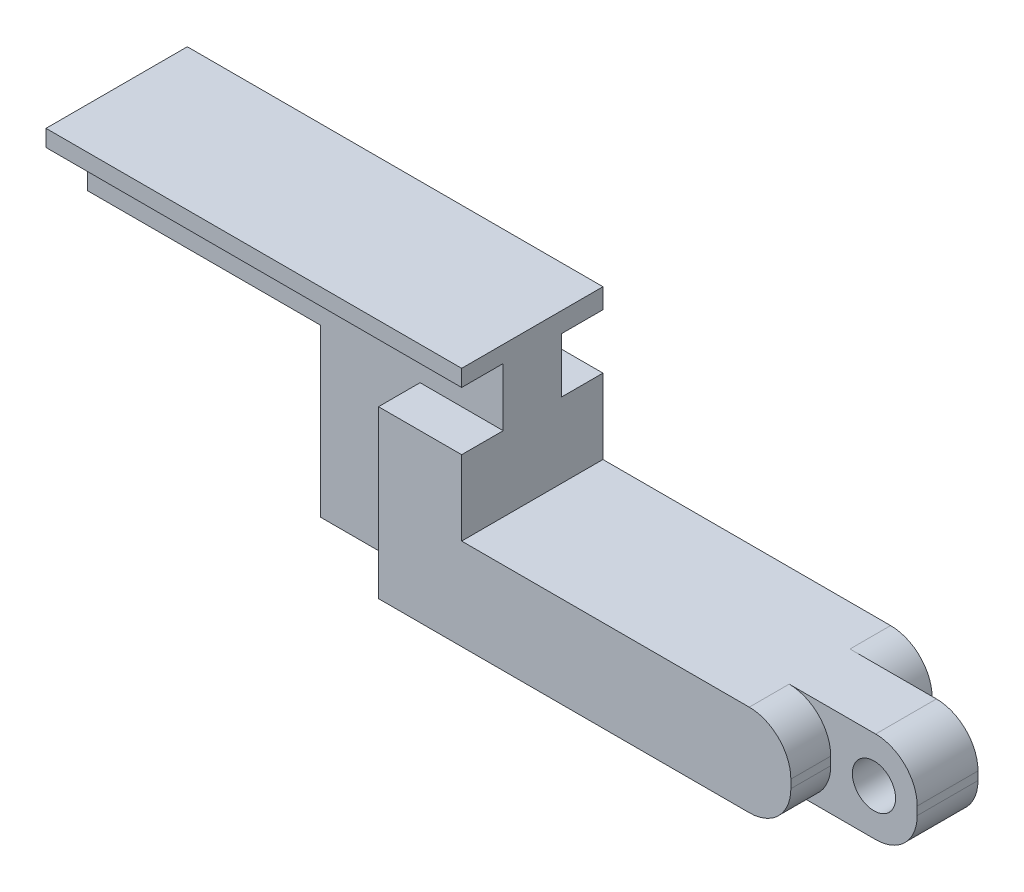
ISO-10303-21;
HEADER;
FILE_DESCRIPTION(('STEP AP214'),'2;1');
FILE_NAME('part.step','',(''),(''),'','','');
FILE_SCHEMA(('AUTOMOTIVE_DESIGN { 1 0 10303 214 1 1 1 1 }'));
ENDSEC;
DATA;
#1=APPLICATION_CONTEXT('core data for automotive mechanical design processes');
#2=APPLICATION_PROTOCOL_DEFINITION('international standard','automotive_design',2000,#1);
#3=PRODUCT_CONTEXT('',#1,'mechanical');
#4=PRODUCT('Part','Part','',(#3));
#5=PRODUCT_RELATED_PRODUCT_CATEGORY('part','',(#4));
#6=PRODUCT_DEFINITION_FORMATION('','',#4);
#7=PRODUCT_DEFINITION_CONTEXT('part definition',#1,'design');
#8=PRODUCT_DEFINITION('design','',#6,#7);
#9=PRODUCT_DEFINITION_SHAPE('','',#8);
#10=(LENGTH_UNIT() NAMED_UNIT(*) SI_UNIT(.MILLI.,.METRE.));
#11=(NAMED_UNIT(*) PLANE_ANGLE_UNIT() SI_UNIT($,.RADIAN.));
#12=(NAMED_UNIT(*) SI_UNIT($,.STERADIAN.) SOLID_ANGLE_UNIT());
#13=UNCERTAINTY_MEASURE_WITH_UNIT(LENGTH_MEASURE(1.E-05),#10,'distance_accuracy_value','');
#14=(GEOMETRIC_REPRESENTATION_CONTEXT(3) GLOBAL_UNCERTAINTY_ASSIGNED_CONTEXT((#13)) GLOBAL_UNIT_ASSIGNED_CONTEXT((#10,
#11,#12)) REPRESENTATION_CONTEXT('',''));
#15=CARTESIAN_POINT('',(0.,0.,0.));
#16=DIRECTION('',(0.,0.,1.));
#17=DIRECTION('',(1.,0.,0.));
#18=AXIS2_PLACEMENT_3D('',#15,#16,#17);
#19=CARTESIAN_POINT('',(50.8,-11.43,-25.4));
#20=DIRECTION('',(1.,0.,0.));
#21=DIRECTION('',(0.,1.,0.));
#22=AXIS2_PLACEMENT_3D('',#19,#20,#21);
#23=PLANE('',#22);
#24=DIRECTION('',(0.,1.,0.));
#25=VECTOR('',#24,1.);
#26=CARTESIAN_POINT('',(50.8,-36.83,-15.24));
#27=LINE('',#26,#25);
#28=CARTESIAN_POINT('',(50.8,-36.83,-15.24));
#29=VERTEX_POINT('',#28);
#30=CARTESIAN_POINT('',(50.8,-11.43,-15.24));
#31=VERTEX_POINT('',#30);
#32=EDGE_CURVE('E250',#29,#31,#27,.T.);
#33=ORIENTED_EDGE('',*,*,#32,.T.);
#34=DIRECTION('',(0.,0.,1.));
#35=VECTOR('',#34,1.);
#36=CARTESIAN_POINT('',(50.8,-11.43,-25.4));
#37=LINE('',#36,#35);
#38=CARTESIAN_POINT('',(50.8,-11.43,-21.59));
#39=VERTEX_POINT('',#38);
#40=EDGE_CURVE('E331',#39,#31,#37,.T.);
#41=ORIENTED_EDGE('',*,*,#40,.F.);
#42=DIRECTION('',(0.,1.,0.));
#43=VECTOR('',#42,1.);
#44=CARTESIAN_POINT('',(50.8,-36.83,-21.59));
#45=LINE('',#44,#43);
#46=CARTESIAN_POINT('',(50.8,-36.83,-21.59));
#47=VERTEX_POINT('',#46);
#48=EDGE_CURVE('E355',#47,#39,#45,.T.);
#49=ORIENTED_EDGE('',*,*,#48,.F.);
#50=DIRECTION('',(0.,0.,1.));
#51=VECTOR('',#50,1.);
#52=CARTESIAN_POINT('',(50.8,-36.83,-25.4));
#53=LINE('',#52,#51);
#54=EDGE_CURVE('E56',#47,#29,#53,.T.);
#55=ORIENTED_EDGE('',*,*,#54,.T.);
#56=EDGE_LOOP('',(#33,#41,#49,#55));
#57=FACE_BOUND('',#56,.T.);
#58=ADVANCED_FACE('F33',(#57),#23,.F.);
#59=DIRECTION('',(0.,1.,0.));
#60=VECTOR('',#59,1.);
#61=CARTESIAN_POINT('',(50.8,-36.83,-6.35));
#62=LINE('',#61,#60);
#63=CARTESIAN_POINT('',(50.8,-36.83,-6.35));
#64=VERTEX_POINT('',#63);
#65=CARTESIAN_POINT('',(50.8,-11.43,-6.35));
#66=VERTEX_POINT('',#65);
#67=EDGE_CURVE('E48',#64,#66,#62,.T.);
#68=ORIENTED_EDGE('',*,*,#67,.F.);
#69=CARTESIAN_POINT('',(50.8,-36.83,0.));
#70=VERTEX_POINT('',#69);
#71=EDGE_CURVE('E226',#64,#70,#53,.T.);
#72=ORIENTED_EDGE('',*,*,#71,.T.);
#73=DIRECTION('',(0.,1.,0.));
#74=VECTOR('',#73,1.);
#75=CARTESIAN_POINT('',(50.8,-11.43,0.));
#76=LINE('',#75,#74);
#77=CARTESIAN_POINT('',(50.8,-11.43,0.));
#78=VERTEX_POINT('',#77);
#79=EDGE_CURVE('E328',#70,#78,#76,.T.);
#80=ORIENTED_EDGE('',*,*,#79,.T.);
#81=DIRECTION('',(0.,0.,-1.));
#82=VECTOR('',#81,1.);
#83=CARTESIAN_POINT('',(50.8,-11.43,-25.4));
#84=LINE('',#83,#82);
#85=EDGE_CURVE('E291',#78,#66,#84,.T.);
#86=ORIENTED_EDGE('',*,*,#85,.T.);
#87=EDGE_LOOP('',(#68,#72,#80,#86));
#88=FACE_BOUND('',#87,.T.);
#89=ADVANCED_FACE('F477',(#88),#23,.F.);
#90=CARTESIAN_POINT('',(0.,-11.43,-25.4));
#91=DIRECTION('',(0.,1.,0.));
#92=DIRECTION('',(0.,0.,1.));
#93=AXIS2_PLACEMENT_3D('',#90,#91,#92);
#94=PLANE('',#93);
#95=DIRECTION('',(0.,0.,-1.));
#96=VECTOR('',#95,1.);
#97=CARTESIAN_POINT('',(35.56,-11.43,-6.35));
#98=LINE('',#97,#96);
#99=CARTESIAN_POINT('',(35.56,-11.43,-6.35));
#100=VERTEX_POINT('',#99);
#101=CARTESIAN_POINT('',(35.56,-11.43,-15.24));
#102=VERTEX_POINT('',#101);
#103=EDGE_CURVE('E247',#100,#102,#98,.T.);
#104=ORIENTED_EDGE('',*,*,#103,.F.);
#105=DIRECTION('',(-1.,0.,0.));
#106=VECTOR('',#105,1.);
#107=CARTESIAN_POINT('',(69.85,-11.43,-6.35));
#108=LINE('',#107,#106);
#109=CARTESIAN_POINT('',(0.,-11.43,-6.35));
#110=VERTEX_POINT('',#109);
#111=EDGE_CURVE('E234',#100,#110,#108,.T.);
#112=ORIENTED_EDGE('',*,*,#111,.T.);
#113=DIRECTION('',(0.,0.,1.));
#114=VECTOR('',#113,1.);
#115=CARTESIAN_POINT('',(0.,-11.43,0.));
#116=LINE('',#115,#114);
#117=CARTESIAN_POINT('',(0.,-11.43,-15.24));
#118=VERTEX_POINT('',#117);
#119=EDGE_CURVE('E352',#118,#110,#116,.T.);
#120=ORIENTED_EDGE('',*,*,#119,.F.);
#121=DIRECTION('',(-1.,0.,0.));
#122=VECTOR('',#121,1.);
#123=CARTESIAN_POINT('',(69.85,-11.43,-15.24));
#124=LINE('',#123,#122);
#125=EDGE_CURVE('E311',#102,#118,#124,.T.);
#126=ORIENTED_EDGE('',*,*,#125,.F.);
#127=EDGE_LOOP('',(#104,#112,#120,#126));
#128=FACE_BOUND('',#127,.T.);
#129=ADVANCED_FACE('F514',(#128),#94,.F.);
#130=CARTESIAN_POINT('',(127.,-36.83,-21.59));
#131=DIRECTION('',(0.,0.,1.));
#132=DIRECTION('',(0.,-1.,0.));
#133=AXIS2_PLACEMENT_3D('',#130,#131,#132);
#134=PLANE('',#133);
#135=DIRECTION('',(0.,1.,0.));
#136=VECTOR('',#135,1.);
#137=CARTESIAN_POINT('',(113.792,-36.83,-21.59));
#138=LINE('',#137,#136);
#139=CARTESIAN_POINT('',(113.792,-30.48,-21.59));
#140=VERTEX_POINT('',#139);
#141=CARTESIAN_POINT('',(113.792,-29.21,-21.59));
#142=VERTEX_POINT('',#141);
#143=EDGE_CURVE('E256',#140,#142,#138,.T.);
#144=ORIENTED_EDGE('',*,*,#143,.F.);
#145=CARTESIAN_POINT('',(107.442,-30.48,-21.59));
#146=DIRECTION('',(0.,0.,1.));
#147=DIRECTION('',(0.,-1.,0.));
#148=AXIS2_PLACEMENT_3D('',#145,#146,#147);
#149=CIRCLE('',#148,6.35);
#150=CARTESIAN_POINT('',(107.442,-36.83,-21.59));
#151=VERTEX_POINT('',#150);
#152=EDGE_CURVE('E417',#140,#151,#149,.F.);
#153=ORIENTED_EDGE('',*,*,#152,.T.);
#154=DIRECTION('',(-1.,0.,0.));
#155=VECTOR('',#154,1.);
#156=CARTESIAN_POINT('',(127.,-36.83,-21.59));
#157=LINE('',#156,#155);
#158=EDGE_CURVE('E346',#151,#47,#157,.T.);
#159=ORIENTED_EDGE('',*,*,#158,.T.);
#160=ORIENTED_EDGE('',*,*,#48,.T.);
#161=DIRECTION('',(-1.,0.,0.));
#162=VECTOR('',#161,1.);
#163=CARTESIAN_POINT('',(69.85,-11.43,-21.59));
#164=LINE('',#163,#162);
#165=CARTESIAN_POINT('',(63.5,-11.43,-21.59));
#166=VERTEX_POINT('',#165);
#167=EDGE_CURVE('E303',#166,#39,#164,.T.);
#168=ORIENTED_EDGE('',*,*,#167,.F.);
#169=DIRECTION('',(0.,-1.,0.));
#170=VECTOR('',#169,1.);
#171=CARTESIAN_POINT('',(63.5,-36.83,-21.59));
#172=LINE('',#171,#170);
#173=CARTESIAN_POINT('',(63.5,-22.86,-21.59));
#174=VERTEX_POINT('',#173);
#175=EDGE_CURVE('E358',#166,#174,#172,.T.);
#176=ORIENTED_EDGE('',*,*,#175,.T.);
#177=DIRECTION('',(1.,0.,0.));
#178=VECTOR('',#177,1.);
#179=CARTESIAN_POINT('',(127.,-22.86,-21.59));
#180=LINE('',#179,#178);
#181=CARTESIAN_POINT('',(107.442,-22.86,-21.59));
#182=VERTEX_POINT('',#181);
#183=EDGE_CURVE('E324',#174,#182,#180,.T.);
#184=ORIENTED_EDGE('',*,*,#183,.T.);
#185=CARTESIAN_POINT('',(107.442,-29.21,-21.59));
#186=DIRECTION('',(0.,0.,1.));
#187=DIRECTION('',(0.,-1.,0.));
#188=AXIS2_PLACEMENT_3D('',#185,#186,#187);
#189=CIRCLE('',#188,6.35);
#190=EDGE_CURVE('E408',#182,#142,#189,.F.);
#191=ORIENTED_EDGE('',*,*,#190,.T.);
#192=EDGE_LOOP('',(#144,#153,#159,#160,#168,#176,#184,#191));
#193=FACE_BOUND('',#192,.T.);
#194=ADVANCED_FACE('F516',(#193),#134,.F.);
#195=CARTESIAN_POINT('',(127.,0.,0.));
#196=DIRECTION('',(0.,0.,-1.));
#197=DIRECTION('',(0.,1.,0.));
#198=AXIS2_PLACEMENT_3D('',#195,#196,#197);
#199=PLANE('',#198);
#200=DIRECTION('',(-1.,0.,0.));
#201=VECTOR('',#200,1.);
#202=CARTESIAN_POINT('',(127.,-36.83,0.));
#203=LINE('',#202,#201);
#204=CARTESIAN_POINT('',(107.442,-36.83,0.));
#205=VERTEX_POINT('',#204);
#206=EDGE_CURVE('E348',#205,#70,#203,.T.);
#207=ORIENTED_EDGE('',*,*,#206,.F.);
#208=CARTESIAN_POINT('',(107.442,-30.48,0.));
#209=DIRECTION('',(0.,0.,-1.));
#210=DIRECTION('',(0.,1.,0.));
#211=AXIS2_PLACEMENT_3D('',#208,#209,#210);
#212=CIRCLE('',#211,6.35);
#213=CARTESIAN_POINT('',(113.792,-30.48,0.));
#214=VERTEX_POINT('',#213);
#215=EDGE_CURVE('E398',#205,#214,#212,.F.);
#216=ORIENTED_EDGE('',*,*,#215,.T.);
#217=DIRECTION('',(0.,-1.,0.));
#218=VECTOR('',#217,1.);
#219=CARTESIAN_POINT('',(113.792,-36.83,0.));
#220=LINE('',#219,#218);
#221=CARTESIAN_POINT('',(113.792,-29.21,0.));
#222=VERTEX_POINT('',#221);
#223=EDGE_CURVE('E272',#222,#214,#220,.T.);
#224=ORIENTED_EDGE('',*,*,#223,.F.);
#225=CARTESIAN_POINT('',(107.442,-29.21,0.));
#226=DIRECTION('',(0.,0.,-1.));
#227=DIRECTION('',(0.,1.,0.));
#228=AXIS2_PLACEMENT_3D('',#225,#226,#227);
#229=CIRCLE('',#228,6.35);
#230=CARTESIAN_POINT('',(107.442,-22.86,0.));
#231=VERTEX_POINT('',#230);
#232=EDGE_CURVE('E385',#222,#231,#229,.F.);
#233=ORIENTED_EDGE('',*,*,#232,.T.);
#234=DIRECTION('',(1.,0.,0.));
#235=VECTOR('',#234,1.);
#236=CARTESIAN_POINT('',(63.5,-22.86,0.));
#237=LINE('',#236,#235);
#238=CARTESIAN_POINT('',(63.5,-22.86,0.));
#239=VERTEX_POINT('',#238);
#240=EDGE_CURVE('E317',#239,#231,#237,.T.);
#241=ORIENTED_EDGE('',*,*,#240,.F.);
#242=DIRECTION('',(0.,-1.,0.));
#243=VECTOR('',#242,1.);
#244=CARTESIAN_POINT('',(63.5,0.,0.));
#245=LINE('',#244,#243);
#246=CARTESIAN_POINT('',(63.5,-11.43,0.));
#247=VERTEX_POINT('',#246);
#248=EDGE_CURVE('E307',#247,#239,#245,.T.);
#249=ORIENTED_EDGE('',*,*,#248,.F.);
#250=DIRECTION('',(-1.,0.,0.));
#251=VECTOR('',#250,1.);
#252=CARTESIAN_POINT('',(69.85,-11.43,0.));
#253=LINE('',#252,#251);
#254=EDGE_CURVE('E288',#247,#78,#253,.T.);
#255=ORIENTED_EDGE('',*,*,#254,.T.);
#256=ORIENTED_EDGE('',*,*,#79,.F.);
#257=EDGE_LOOP('',(#207,#216,#224,#233,#241,#249,#255,#256));
#258=FACE_BOUND('',#257,.T.);
#259=ADVANCED_FACE('F470',(#258),#199,.F.);
#260=CARTESIAN_POINT('',(63.5,0.,-21.59));
#261=VERTEX_POINT('',#260);
#262=CARTESIAN_POINT('',(63.5,-3.048,-21.59));
#263=VERTEX_POINT('',#262);
#264=EDGE_CURVE('E359',#261,#263,#172,.T.);
#265=ORIENTED_EDGE('',*,*,#264,.T.);
#266=DIRECTION('',(-1.,0.,0.));
#267=VECTOR('',#266,1.);
#268=CARTESIAN_POINT('',(69.85,-3.048,-21.59));
#269=LINE('',#268,#267);
#270=CARTESIAN_POINT('',(0.,-3.048,-21.59));
#271=VERTEX_POINT('',#270);
#272=EDGE_CURVE('E304',#263,#271,#269,.T.);
#273=ORIENTED_EDGE('',*,*,#272,.T.);
#274=DIRECTION('',(0.,1.,0.));
#275=VECTOR('',#274,1.);
#276=CARTESIAN_POINT('',(0.,-36.83,-21.59));
#277=LINE('',#276,#275);
#278=CARTESIAN_POINT('',(0.,0.,-21.59));
#279=VERTEX_POINT('',#278);
#280=EDGE_CURVE('E341',#271,#279,#277,.T.);
#281=ORIENTED_EDGE('',*,*,#280,.T.);
#282=DIRECTION('',(-1.,0.,0.));
#283=VECTOR('',#282,1.);
#284=CARTESIAN_POINT('',(127.,0.,-21.59));
#285=LINE('',#284,#283);
#286=EDGE_CURVE('E343',#261,#279,#285,.T.);
#287=ORIENTED_EDGE('',*,*,#286,.F.);
#288=EDGE_LOOP('',(#265,#273,#281,#287));
#289=FACE_BOUND('',#288,.T.);
#290=ADVANCED_FACE('F502',(#289),#134,.F.);
#291=CARTESIAN_POINT('',(127.,0.,-21.59));
#292=DIRECTION('',(0.,-1.,0.));
#293=DIRECTION('',(0.,0.,-1.));
#294=AXIS2_PLACEMENT_3D('',#291,#292,#293);
#295=PLANE('',#294);
#296=DIRECTION('',(-1.,0.,0.));
#297=VECTOR('',#296,1.);
#298=CARTESIAN_POINT('',(127.,0.,0.));
#299=LINE('',#298,#297);
#300=CARTESIAN_POINT('',(63.5,0.,0.));
#301=VERTEX_POINT('',#300);
#302=CARTESIAN_POINT('',(0.,0.,0.));
#303=VERTEX_POINT('',#302);
#304=EDGE_CURVE('E350',#301,#303,#299,.T.);
#305=ORIENTED_EDGE('',*,*,#304,.F.);
#306=DIRECTION('',(0.,0.,1.));
#307=VECTOR('',#306,1.);
#308=CARTESIAN_POINT('',(63.5,0.,-22.86));
#309=LINE('',#308,#307);
#310=EDGE_CURVE('E320',#261,#301,#309,.T.);
#311=ORIENTED_EDGE('',*,*,#310,.F.);
#312=ORIENTED_EDGE('',*,*,#286,.T.);
#313=DIRECTION('',(0.,0.,1.));
#314=VECTOR('',#313,1.);
#315=CARTESIAN_POINT('',(0.,0.,-21.59));
#316=LINE('',#315,#314);
#317=EDGE_CURVE('E334',#279,#303,#316,.T.);
#318=ORIENTED_EDGE('',*,*,#317,.T.);
#319=EDGE_LOOP('',(#305,#311,#312,#318));
#320=FACE_BOUND('',#319,.T.);
#321=ADVANCED_FACE('F498',(#320),#295,.F.);
#322=DIRECTION('',(0.,-1.,0.));
#323=VECTOR('',#322,1.);
#324=CARTESIAN_POINT('',(0.,0.,0.));
#325=LINE('',#324,#323);
#326=CARTESIAN_POINT('',(0.,-2.54,0.));
#327=VERTEX_POINT('',#326);
#328=EDGE_CURVE('E338',#303,#327,#325,.T.);
#329=ORIENTED_EDGE('',*,*,#328,.T.);
#330=DIRECTION('',(-1.,0.,0.));
#331=VECTOR('',#330,1.);
#332=CARTESIAN_POINT('',(69.85,-2.54,0.));
#333=LINE('',#332,#331);
#334=CARTESIAN_POINT('',(63.5,-2.54,0.));
#335=VERTEX_POINT('',#334);
#336=EDGE_CURVE('E287',#335,#327,#333,.T.);
#337=ORIENTED_EDGE('',*,*,#336,.F.);
#338=EDGE_CURVE('E314',#301,#335,#245,.T.);
#339=ORIENTED_EDGE('',*,*,#338,.F.);
#340=ORIENTED_EDGE('',*,*,#304,.T.);
#341=EDGE_LOOP('',(#329,#337,#339,#340));
#342=FACE_BOUND('',#341,.T.);
#343=ADVANCED_FACE('F489',(#342),#199,.F.);
#344=CARTESIAN_POINT('',(127.,-36.83,0.));
#345=DIRECTION('',(0.,1.,0.));
#346=DIRECTION('',(0.,0.,1.));
#347=AXIS2_PLACEMENT_3D('',#344,#345,#346);
#348=PLANE('',#347);
#349=DIRECTION('',(1.,0.,0.));
#350=VECTOR('',#349,1.);
#351=CARTESIAN_POINT('',(113.792,-36.83,-15.3845862759518));
#352=LINE('',#351,#350);
#353=CARTESIAN_POINT('',(107.442,-36.83,-15.3845862759518));
#354=VERTEX_POINT('',#353);
#355=CARTESIAN_POINT('',(120.65,-36.83,-15.3845862759518));
#356=VERTEX_POINT('',#355);
#357=EDGE_CURVE('E265',#354,#356,#352,.T.);
#358=ORIENTED_EDGE('',*,*,#357,.T.);
#359=DIRECTION('',(0.,0.,-1.));
#360=VECTOR('',#359,1.);
#361=CARTESIAN_POINT('',(120.65,-36.83,-6.09600000000001));
#362=LINE('',#361,#360);
#363=CARTESIAN_POINT('',(120.65,-36.83,-6.09600000000001));
#364=VERTEX_POINT('',#363);
#365=EDGE_CURVE('E41',#356,#364,#362,.F.);
#366=ORIENTED_EDGE('',*,*,#365,.T.);
#367=DIRECTION('',(1.,0.,0.));
#368=VECTOR('',#367,1.);
#369=CARTESIAN_POINT('',(113.792,-36.83,-6.09600000000001));
#370=LINE('',#369,#368);
#371=CARTESIAN_POINT('',(107.442,-36.83,-6.09600000000001));
#372=VERTEX_POINT('',#371);
#373=EDGE_CURVE('E275',#372,#364,#370,.T.);
#374=ORIENTED_EDGE('',*,*,#373,.F.);
#375=DIRECTION('',(0.,0.,-1.));
#376=VECTOR('',#375,1.);
#377=CARTESIAN_POINT('',(107.442,-36.83,0.));
#378=LINE('',#377,#376);
#379=EDGE_CURVE('E396',#372,#205,#378,.F.);
#380=ORIENTED_EDGE('',*,*,#379,.T.);
#381=ORIENTED_EDGE('',*,*,#206,.T.);
#382=ORIENTED_EDGE('',*,*,#71,.F.);
#383=DIRECTION('',(-1.,0.,0.));
#384=VECTOR('',#383,1.);
#385=CARTESIAN_POINT('',(50.8,-36.83,-6.35));
#386=LINE('',#385,#384);
#387=CARTESIAN_POINT('',(35.56,-36.83,-6.35));
#388=VERTEX_POINT('',#387);
#389=EDGE_CURVE('E218',#64,#388,#386,.T.);
#390=ORIENTED_EDGE('',*,*,#389,.T.);
#391=DIRECTION('',(0.,0.,-1.));
#392=VECTOR('',#391,1.);
#393=CARTESIAN_POINT('',(35.56,-36.83,-6.35));
#394=LINE('',#393,#392);
#395=CARTESIAN_POINT('',(35.56,-36.83,-15.24));
#396=VERTEX_POINT('',#395);
#397=EDGE_CURVE('E223',#388,#396,#394,.T.);
#398=ORIENTED_EDGE('',*,*,#397,.T.);
#399=DIRECTION('',(1.,0.,0.));
#400=VECTOR('',#399,1.);
#401=CARTESIAN_POINT('',(35.56,-36.83,-15.24));
#402=LINE('',#401,#400);
#403=EDGE_CURVE('E228',#396,#29,#402,.T.);
#404=ORIENTED_EDGE('',*,*,#403,.T.);
#405=ORIENTED_EDGE('',*,*,#54,.F.);
#406=ORIENTED_EDGE('',*,*,#158,.F.);
#407=DIRECTION('',(0.,0.,-1.));
#408=VECTOR('',#407,1.);
#409=CARTESIAN_POINT('',(107.442,-36.83,-15.3845862759518));
#410=LINE('',#409,#408);
#411=EDGE_CURVE('E419',#151,#354,#410,.F.);
#412=ORIENTED_EDGE('',*,*,#411,.T.);
#413=EDGE_LOOP('',(#358,#366,#374,#380,#381,#382,#390,#398,#404,#405,#406,#412));
#414=FACE_BOUND('',#413,.T.);
#415=ADVANCED_FACE('F221',(#414),#348,.F.);
#416=CARTESIAN_POINT('',(127.,0.,0.));
#417=DIRECTION('',(1.,0.,0.));
#418=DIRECTION('',(0.,0.,-1.));
#419=AXIS2_PLACEMENT_3D('',#416,#417,#418);
#420=PLANE('',#419);
#421=DIRECTION('',(0.,1.,0.));
#422=VECTOR('',#421,1.);
#423=CARTESIAN_POINT('',(127.,-22.86,-6.09600000000001));
#424=LINE('',#423,#422);
#425=CARTESIAN_POINT('',(127.,-30.48,-6.09600000000001));
#426=VERTEX_POINT('',#425);
#427=CARTESIAN_POINT('',(127.,-29.21,-6.09600000000001));
#428=VERTEX_POINT('',#427);
#429=EDGE_CURVE('E267',#426,#428,#424,.T.);
#430=ORIENTED_EDGE('',*,*,#429,.F.);
#431=DIRECTION('',(0.,0.,-1.));
#432=VECTOR('',#431,1.);
#433=CARTESIAN_POINT('',(127.,-30.48,-15.3845862759518));
#434=LINE('',#433,#432);
#435=CARTESIAN_POINT('',(127.,-30.48,-15.3845862759518));
#436=VERTEX_POINT('',#435);
#437=EDGE_CURVE('E434',#426,#436,#434,.T.);
#438=ORIENTED_EDGE('',*,*,#437,.T.);
#439=DIRECTION('',(0.,-1.,0.));
#440=VECTOR('',#439,1.);
#441=CARTESIAN_POINT('',(127.,-22.86,-15.3845862759518));
#442=LINE('',#441,#440);
#443=CARTESIAN_POINT('',(127.,-29.21,-15.3845862759518));
#444=VERTEX_POINT('',#443);
#445=EDGE_CURVE('E259',#444,#436,#442,.T.);
#446=ORIENTED_EDGE('',*,*,#445,.F.);
#447=DIRECTION('',(0.,0.,-1.));
#448=VECTOR('',#447,1.);
#449=CARTESIAN_POINT('',(127.,-29.21,-6.096));
#450=LINE('',#449,#448);
#451=EDGE_CURVE('E429',#444,#428,#450,.F.);
#452=ORIENTED_EDGE('',*,*,#451,.T.);
#453=EDGE_LOOP('',(#430,#438,#446,#452));
#454=FACE_BOUND('',#453,.T.);
#455=ADVANCED_FACE('F449',(#454),#420,.T.);
#456=CARTESIAN_POINT('',(0.,0.,0.));
#457=DIRECTION('',(1.,0.,0.));
#458=DIRECTION('',(0.,0.,-1.));
#459=AXIS2_PLACEMENT_3D('',#456,#457,#458);
#460=PLANE('',#459);
#461=ORIENTED_EDGE('',*,*,#119,.T.);
#462=DIRECTION('',(0.,-1.,0.));
#463=VECTOR('',#462,1.);
#464=CARTESIAN_POINT('',(0.,-11.43,-6.35));
#465=LINE('',#464,#463);
#466=CARTESIAN_POINT('',(0.,-2.54,-6.35));
#467=VERTEX_POINT('',#466);
#468=EDGE_CURVE('E285',#467,#110,#465,.T.);
#469=ORIENTED_EDGE('',*,*,#468,.F.);
#470=DIRECTION('',(0.,0.,-1.));
#471=VECTOR('',#470,1.);
#472=CARTESIAN_POINT('',(0.,-2.54,-6.35));
#473=LINE('',#472,#471);
#474=EDGE_CURVE('E280',#327,#467,#473,.T.);
#475=ORIENTED_EDGE('',*,*,#474,.F.);
#476=ORIENTED_EDGE('',*,*,#328,.F.);
#477=ORIENTED_EDGE('',*,*,#317,.F.);
#478=ORIENTED_EDGE('',*,*,#280,.F.);
#479=DIRECTION('',(0.,0.,-1.));
#480=VECTOR('',#479,1.);
#481=CARTESIAN_POINT('',(0.,-3.04799999999999,-15.24));
#482=LINE('',#481,#480);
#483=CARTESIAN_POINT('',(0.,-3.04799999999999,-15.24));
#484=VERTEX_POINT('',#483);
#485=EDGE_CURVE('E301',#484,#271,#482,.T.);
#486=ORIENTED_EDGE('',*,*,#485,.F.);
#487=DIRECTION('',(0.,1.,0.));
#488=VECTOR('',#487,1.);
#489=CARTESIAN_POINT('',(0.,-11.43,-15.24));
#490=LINE('',#489,#488);
#491=EDGE_CURVE('E298',#118,#484,#490,.T.);
#492=ORIENTED_EDGE('',*,*,#491,.F.);
#493=EDGE_LOOP('',(#461,#469,#475,#476,#477,#478,#486,#492));
#494=FACE_BOUND('',#493,.T.);
#495=ADVANCED_FACE('F494',(#494),#460,.F.);
#496=CARTESIAN_POINT('',(63.5,0.,-22.86));
#497=DIRECTION('',(-1.,0.,0.));
#498=DIRECTION('',(0.,0.,1.));
#499=AXIS2_PLACEMENT_3D('',#496,#497,#498);
#500=PLANE('',#499);
#501=DIRECTION('',(0.,-1.,0.));
#502=VECTOR('',#501,1.);
#503=CARTESIAN_POINT('',(63.5,0.,-6.35));
#504=LINE('',#503,#502);
#505=CARTESIAN_POINT('',(63.5,-2.54,-6.35));
#506=VERTEX_POINT('',#505);
#507=CARTESIAN_POINT('',(63.5,-11.43,-6.35));
#508=VERTEX_POINT('',#507);
#509=EDGE_CURVE('E374',#506,#508,#504,.T.);
#510=ORIENTED_EDGE('',*,*,#509,.T.);
#511=DIRECTION('',(0.,0.,1.));
#512=VECTOR('',#511,1.);
#513=CARTESIAN_POINT('',(63.5,-11.43,-22.86));
#514=LINE('',#513,#512);
#515=EDGE_CURVE('E377',#508,#247,#514,.T.);
#516=ORIENTED_EDGE('',*,*,#515,.T.);
#517=ORIENTED_EDGE('',*,*,#248,.T.);
#518=DIRECTION('',(0.,0.,1.));
#519=VECTOR('',#518,1.);
#520=CARTESIAN_POINT('',(63.5,-22.86,-22.86));
#521=LINE('',#520,#519);
#522=EDGE_CURVE('E321',#174,#239,#521,.T.);
#523=ORIENTED_EDGE('',*,*,#522,.F.);
#524=ORIENTED_EDGE('',*,*,#175,.F.);
#525=DIRECTION('',(0.,0.,1.));
#526=VECTOR('',#525,1.);
#527=CARTESIAN_POINT('',(63.5,-11.43,-22.86));
#528=LINE('',#527,#526);
#529=CARTESIAN_POINT('',(63.5,-11.43,-15.24));
#530=VERTEX_POINT('',#529);
#531=EDGE_CURVE('E362',#166,#530,#528,.T.);
#532=ORIENTED_EDGE('',*,*,#531,.T.);
#533=DIRECTION('',(0.,1.,0.));
#534=VECTOR('',#533,1.);
#535=CARTESIAN_POINT('',(63.5,0.,-15.24));
#536=LINE('',#535,#534);
#537=CARTESIAN_POINT('',(63.5,-3.04799999999999,-15.24));
#538=VERTEX_POINT('',#537);
#539=EDGE_CURVE('E365',#530,#538,#536,.T.);
#540=ORIENTED_EDGE('',*,*,#539,.T.);
#541=DIRECTION('',(0.,0.,-1.));
#542=VECTOR('',#541,1.);
#543=CARTESIAN_POINT('',(63.5,-3.048,-22.86));
#544=LINE('',#543,#542);
#545=EDGE_CURVE('E368',#538,#263,#544,.T.);
#546=ORIENTED_EDGE('',*,*,#545,.T.);
#547=ORIENTED_EDGE('',*,*,#264,.F.);
#548=ORIENTED_EDGE('',*,*,#310,.T.);
#549=ORIENTED_EDGE('',*,*,#338,.T.);
#550=DIRECTION('',(0.,0.,-1.));
#551=VECTOR('',#550,1.);
#552=CARTESIAN_POINT('',(63.5,-2.54,-22.86));
#553=LINE('',#552,#551);
#554=EDGE_CURVE('E371',#335,#506,#553,.T.);
#555=ORIENTED_EDGE('',*,*,#554,.T.);
#556=EDGE_LOOP('',(#510,#516,#517,#523,#524,#532,#540,#546,#547,#548,#549,#555));
#557=FACE_BOUND('',#556,.T.);
#558=ADVANCED_FACE('F482',(#557),#500,.F.);
#559=CARTESIAN_POINT('',(63.5,-22.86,-22.86));
#560=DIRECTION('',(0.,-1.,0.));
#561=DIRECTION('',(0.,0.,-1.));
#562=AXIS2_PLACEMENT_3D('',#559,#560,#561);
#563=PLANE('',#562);
#564=DIRECTION('',(1.,0.,0.));
#565=VECTOR('',#564,1.);
#566=CARTESIAN_POINT('',(113.792,-22.86,-6.09600000000001));
#567=LINE('',#566,#565);
#568=CARTESIAN_POINT('',(107.442,-22.86,-6.09600000000001));
#569=VERTEX_POINT('',#568);
#570=CARTESIAN_POINT('',(120.65,-22.86,-6.09600000000001));
#571=VERTEX_POINT('',#570);
#572=EDGE_CURVE('E277',#569,#571,#567,.T.);
#573=ORIENTED_EDGE('',*,*,#572,.T.);
#574=DIRECTION('',(0.,0.,-1.));
#575=VECTOR('',#574,1.);
#576=CARTESIAN_POINT('',(120.65,-22.86,-15.3845862759518));
#577=LINE('',#576,#575);
#578=CARTESIAN_POINT('',(120.65,-22.86,-15.3845862759518));
#579=VERTEX_POINT('',#578);
#580=EDGE_CURVE('E424',#571,#579,#577,.T.);
#581=ORIENTED_EDGE('',*,*,#580,.T.);
#582=DIRECTION('',(1.,0.,0.));
#583=VECTOR('',#582,1.);
#584=CARTESIAN_POINT('',(113.792,-22.86,-15.3845862759518));
#585=LINE('',#584,#583);
#586=CARTESIAN_POINT('',(107.442,-22.86,-15.3845862759518));
#587=VERTEX_POINT('',#586);
#588=EDGE_CURVE('E262',#587,#579,#585,.T.);
#589=ORIENTED_EDGE('',*,*,#588,.F.);
#590=DIRECTION('',(0.,0.,1.));
#591=VECTOR('',#590,1.);
#592=CARTESIAN_POINT('',(107.442,-22.86,-21.59));
#593=LINE('',#592,#591);
#594=EDGE_CURVE('E406',#587,#182,#593,.F.);
#595=ORIENTED_EDGE('',*,*,#594,.T.);
#596=ORIENTED_EDGE('',*,*,#183,.F.);
#597=ORIENTED_EDGE('',*,*,#522,.T.);
#598=ORIENTED_EDGE('',*,*,#240,.T.);
#599=DIRECTION('',(0.,0.,1.));
#600=VECTOR('',#599,1.);
#601=CARTESIAN_POINT('',(107.442,-22.86,-22.86));
#602=LINE('',#601,#600);
#603=EDGE_CURVE('E387',#231,#569,#602,.F.);
#604=ORIENTED_EDGE('',*,*,#603,.T.);
#605=EDGE_LOOP('',(#573,#581,#589,#595,#596,#597,#598,#604));
#606=FACE_BOUND('',#605,.T.);
#607=ADVANCED_FACE('F458',(#606),#563,.F.);
#608=CARTESIAN_POINT('',(69.85,-3.04799999999999,-15.24));
#609=DIRECTION('',(0.,1.,0.));
#610=DIRECTION('',(0.,0.,1.));
#611=AXIS2_PLACEMENT_3D('',#608,#609,#610);
#612=PLANE('',#611);
#613=DIRECTION('',(-1.,0.,0.));
#614=VECTOR('',#613,1.);
#615=CARTESIAN_POINT('',(69.85,-3.04799999999999,-15.24));
#616=LINE('',#615,#614);
#617=EDGE_CURVE('E308',#538,#484,#616,.T.);
#618=ORIENTED_EDGE('',*,*,#617,.T.);
#619=ORIENTED_EDGE('',*,*,#485,.T.);
#620=ORIENTED_EDGE('',*,*,#272,.F.);
#621=ORIENTED_EDGE('',*,*,#545,.F.);
#622=EDGE_LOOP('',(#618,#619,#620,#621));
#623=FACE_BOUND('',#622,.T.);
#624=ADVANCED_FACE('F507',(#623),#612,.F.);
#625=CARTESIAN_POINT('',(69.85,-11.43,-15.24));
#626=DIRECTION('',(0.,0.,1.));
#627=DIRECTION('',(1.,0.,0.));
#628=AXIS2_PLACEMENT_3D('',#625,#626,#627);
#629=PLANE('',#628);
#630=EDGE_CURVE('E310',#530,#31,#124,.T.);
#631=ORIENTED_EDGE('',*,*,#630,.T.);
#632=ORIENTED_EDGE('',*,*,#32,.F.);
#633=ORIENTED_EDGE('',*,*,#403,.F.);
#634=DIRECTION('',(0.,1.,0.));
#635=VECTOR('',#634,1.);
#636=CARTESIAN_POINT('',(35.56,-36.83,-15.24));
#637=LINE('',#636,#635);
#638=EDGE_CURVE('E238',#396,#102,#637,.T.);
#639=ORIENTED_EDGE('',*,*,#638,.T.);
#640=ORIENTED_EDGE('',*,*,#125,.T.);
#641=ORIENTED_EDGE('',*,*,#491,.T.);
#642=ORIENTED_EDGE('',*,*,#617,.F.);
#643=ORIENTED_EDGE('',*,*,#539,.F.);
#644=EDGE_LOOP('',(#631,#632,#633,#639,#640,#641,#642,#643));
#645=FACE_BOUND('',#644,.T.);
#646=ADVANCED_FACE('F512',(#645),#629,.F.);
#647=CARTESIAN_POINT('',(69.85,-11.43,-21.59));
#648=DIRECTION('',(0.,-1.,0.));
#649=DIRECTION('',(0.,0.,-1.));
#650=AXIS2_PLACEMENT_3D('',#647,#648,#649);
#651=PLANE('',#650);
#652=ORIENTED_EDGE('',*,*,#630,.F.);
#653=ORIENTED_EDGE('',*,*,#531,.F.);
#654=ORIENTED_EDGE('',*,*,#167,.T.);
#655=ORIENTED_EDGE('',*,*,#40,.T.);
#656=EDGE_LOOP('',(#652,#653,#654,#655));
#657=FACE_BOUND('',#656,.T.);
#658=ADVANCED_FACE('F581',(#657),#651,.F.);
#659=CARTESIAN_POINT('',(69.85,-11.43,0.));
#660=DIRECTION('',(0.,-1.,0.));
#661=DIRECTION('',(0.,0.,-1.));
#662=AXIS2_PLACEMENT_3D('',#659,#660,#661);
#663=PLANE('',#662);
#664=ORIENTED_EDGE('',*,*,#254,.F.);
#665=ORIENTED_EDGE('',*,*,#515,.F.);
#666=EDGE_CURVE('E292',#508,#66,#108,.T.);
#667=ORIENTED_EDGE('',*,*,#666,.T.);
#668=ORIENTED_EDGE('',*,*,#85,.F.);
#669=EDGE_LOOP('',(#664,#665,#667,#668));
#670=FACE_BOUND('',#669,.T.);
#671=ADVANCED_FACE('F578',(#670),#663,.F.);
#672=CARTESIAN_POINT('',(69.85,-11.43,-6.35));
#673=DIRECTION('',(0.,0.,-1.));
#674=DIRECTION('',(0.,1.,0.));
#675=AXIS2_PLACEMENT_3D('',#672,#673,#674);
#676=PLANE('',#675);
#677=DIRECTION('',(-1.,0.,0.));
#678=VECTOR('',#677,1.);
#679=CARTESIAN_POINT('',(69.85,-2.54,-6.35));
#680=LINE('',#679,#678);
#681=EDGE_CURVE('E294',#506,#467,#680,.T.);
#682=ORIENTED_EDGE('',*,*,#681,.T.);
#683=ORIENTED_EDGE('',*,*,#468,.T.);
#684=ORIENTED_EDGE('',*,*,#111,.F.);
#685=DIRECTION('',(0.,1.,0.));
#686=VECTOR('',#685,1.);
#687=CARTESIAN_POINT('',(35.56,-36.83,-6.35));
#688=LINE('',#687,#686);
#689=EDGE_CURVE('E231',#388,#100,#688,.T.);
#690=ORIENTED_EDGE('',*,*,#689,.F.);
#691=ORIENTED_EDGE('',*,*,#389,.F.);
#692=ORIENTED_EDGE('',*,*,#67,.T.);
#693=ORIENTED_EDGE('',*,*,#666,.F.);
#694=ORIENTED_EDGE('',*,*,#509,.F.);
#695=EDGE_LOOP('',(#682,#683,#684,#690,#691,#692,#693,#694));
#696=FACE_BOUND('',#695,.T.);
#697=ADVANCED_FACE('F232',(#696),#676,.F.);
#698=CARTESIAN_POINT('',(69.85,-2.54,-6.35));
#699=DIRECTION('',(0.,1.,0.));
#700=DIRECTION('',(0.,0.,1.));
#701=AXIS2_PLACEMENT_3D('',#698,#699,#700);
#702=PLANE('',#701);
#703=ORIENTED_EDGE('',*,*,#336,.T.);
#704=ORIENTED_EDGE('',*,*,#474,.T.);
#705=ORIENTED_EDGE('',*,*,#681,.F.);
#706=ORIENTED_EDGE('',*,*,#554,.F.);
#707=EDGE_LOOP('',(#703,#704,#705,#706));
#708=FACE_BOUND('',#707,.T.);
#709=ADVANCED_FACE('F486',(#708),#702,.F.);
#710=CARTESIAN_POINT('',(113.792,-22.86,-6.09600000000001));
#711=DIRECTION('',(0.,0.,-1.));
#712=DIRECTION('',(0.,1.,0.));
#713=AXIS2_PLACEMENT_3D('',#710,#711,#712);
#714=PLANE('',#713);
#715=CARTESIAN_POINT('',(120.396,-29.845,-6.096));
#716=DIRECTION('',(0.,0.,1.));
#717=DIRECTION('',(1.,0.,0.));
#718=AXIS2_PLACEMENT_3D('',#715,#716,#717);
#719=CIRCLE('',#718,3.302);
#720=CARTESIAN_POINT('',(123.698,-29.845,-6.096));
#721=VERTEX_POINT('',#720);
#722=EDGE_CURVE('E252',#721,#721,#719,.T.);
#723=ORIENTED_EDGE('',*,*,#722,.F.);
#724=EDGE_LOOP('',(#723));
#725=FACE_BOUND('',#724,.T.);
#726=ORIENTED_EDGE('',*,*,#373,.T.);
#727=CARTESIAN_POINT('',(120.65,-30.48,-6.09600000000001));
#728=DIRECTION('',(0.,0.,-1.));
#729=DIRECTION('',(0.,1.,0.));
#730=AXIS2_PLACEMENT_3D('',#727,#728,#729);
#731=CIRCLE('',#730,6.35);
#732=EDGE_CURVE('E11',#364,#426,#731,.F.);
#733=ORIENTED_EDGE('',*,*,#732,.T.);
#734=ORIENTED_EDGE('',*,*,#429,.T.);
#735=CARTESIAN_POINT('',(120.65,-29.21,-6.096));
#736=DIRECTION('',(0.,0.,-1.));
#737=DIRECTION('',(0.,1.,0.));
#738=AXIS2_PLACEMENT_3D('',#735,#736,#737);
#739=CIRCLE('',#738,6.35);
#740=EDGE_CURVE('E432',#428,#571,#739,.F.);
#741=ORIENTED_EDGE('',*,*,#740,.T.);
#742=ORIENTED_EDGE('',*,*,#572,.F.);
#743=CARTESIAN_POINT('',(107.442,-29.21,-6.09600000000001));
#744=DIRECTION('',(0.,0.,-1.));
#745=DIRECTION('',(0.,1.,0.));
#746=AXIS2_PLACEMENT_3D('',#743,#744,#745);
#747=CIRCLE('',#746,6.35);
#748=CARTESIAN_POINT('',(113.792,-29.21,-6.09600000000001));
#749=VERTEX_POINT('',#748);
#750=EDGE_CURVE('E390',#569,#749,#747,.T.);
#751=ORIENTED_EDGE('',*,*,#750,.T.);
#752=DIRECTION('',(0.,1.,0.));
#753=VECTOR('',#752,1.);
#754=CARTESIAN_POINT('',(113.792,-22.86,-6.09600000000001));
#755=LINE('',#754,#753);
#756=CARTESIAN_POINT('',(113.792,-30.48,-6.09600000000001));
#757=VERTEX_POINT('',#756);
#758=EDGE_CURVE('E270',#757,#749,#755,.T.);
#759=ORIENTED_EDGE('',*,*,#758,.F.);
#760=CARTESIAN_POINT('',(107.442,-30.48,-6.09600000000001));
#761=DIRECTION('',(0.,0.,-1.));
#762=DIRECTION('',(0.,1.,0.));
#763=AXIS2_PLACEMENT_3D('',#760,#761,#762);
#764=CIRCLE('',#763,6.35);
#765=EDGE_CURVE('E400',#757,#372,#764,.T.);
#766=ORIENTED_EDGE('',*,*,#765,.T.);
#767=EDGE_LOOP('',(#726,#733,#734,#741,#742,#751,#759,#766));
#768=FACE_BOUND('',#767,.T.);
#769=ADVANCED_FACE('F442',(#725,#768),#714,.F.);
#770=CARTESIAN_POINT('',(113.792,0.,0.));
#771=DIRECTION('',(-1.,0.,0.));
#772=DIRECTION('',(0.,0.,1.));
#773=AXIS2_PLACEMENT_3D('',#770,#771,#772);
#774=PLANE('',#773);
#775=ORIENTED_EDGE('',*,*,#223,.T.);
#776=DIRECTION('',(0.,0.,-1.));
#777=VECTOR('',#776,1.);
#778=CARTESIAN_POINT('',(113.792,-30.48,0.));
#779=LINE('',#778,#777);
#780=EDGE_CURVE('E393',#214,#757,#779,.T.);
#781=ORIENTED_EDGE('',*,*,#780,.T.);
#782=ORIENTED_EDGE('',*,*,#758,.T.);
#783=DIRECTION('',(0.,0.,1.));
#784=VECTOR('',#783,1.);
#785=CARTESIAN_POINT('',(113.792,-29.21,0.));
#786=LINE('',#785,#784);
#787=EDGE_CURVE('E380',#749,#222,#786,.T.);
#788=ORIENTED_EDGE('',*,*,#787,.T.);
#789=EDGE_LOOP('',(#775,#781,#782,#788));
#790=FACE_BOUND('',#789,.T.);
#791=ADVANCED_FACE('F466',(#790),#774,.F.);
#792=CARTESIAN_POINT('',(113.792,-22.86,-15.3845862759518));
#793=DIRECTION('',(0.,0.,1.));
#794=DIRECTION('',(0.,-1.,0.));
#795=AXIS2_PLACEMENT_3D('',#792,#793,#794);
#796=PLANE('',#795);
#797=CARTESIAN_POINT('',(120.396,-29.845,-15.3845862759518));
#798=DIRECTION('',(0.,0.,1.));
#799=DIRECTION('',(0.,-1.,0.));
#800=AXIS2_PLACEMENT_3D('',#797,#798,#799);
#801=CIRCLE('',#800,3.302);
#802=CARTESIAN_POINT('',(123.698,-29.845,-15.3845862759518));
#803=VERTEX_POINT('',#802);
#804=EDGE_CURVE('E255',#803,#803,#801,.T.);
#805=ORIENTED_EDGE('',*,*,#804,.T.);
#806=EDGE_LOOP('',(#805));
#807=FACE_BOUND('',#806,.T.);
#808=ORIENTED_EDGE('',*,*,#445,.T.);
#809=CARTESIAN_POINT('',(120.65,-30.48,-15.3845862759518));
#810=DIRECTION('',(0.,0.,1.));
#811=DIRECTION('',(0.,-1.,0.));
#812=AXIS2_PLACEMENT_3D('',#809,#810,#811);
#813=CIRCLE('',#812,6.35);
#814=EDGE_CURVE('E437',#436,#356,#813,.F.);
#815=ORIENTED_EDGE('',*,*,#814,.T.);
#816=ORIENTED_EDGE('',*,*,#357,.F.);
#817=CARTESIAN_POINT('',(107.442,-30.48,-15.3845862759518));
#818=DIRECTION('',(0.,0.,1.));
#819=DIRECTION('',(0.,-1.,0.));
#820=AXIS2_PLACEMENT_3D('',#817,#818,#819);
#821=CIRCLE('',#820,6.35);
#822=CARTESIAN_POINT('',(113.792,-30.48,-15.3845862759518));
#823=VERTEX_POINT('',#822);
#824=EDGE_CURVE('E422',#354,#823,#821,.T.);
#825=ORIENTED_EDGE('',*,*,#824,.T.);
#826=DIRECTION('',(0.,-1.,0.));
#827=VECTOR('',#826,1.);
#828=CARTESIAN_POINT('',(113.792,-22.86,-15.3845862759518));
#829=LINE('',#828,#827);
#830=CARTESIAN_POINT('',(113.792,-29.21,-15.3845862759518));
#831=VERTEX_POINT('',#830);
#832=EDGE_CURVE('E258',#831,#823,#829,.T.);
#833=ORIENTED_EDGE('',*,*,#832,.F.);
#834=CARTESIAN_POINT('',(107.442,-29.21,-15.3845862759518));
#835=DIRECTION('',(0.,0.,1.));
#836=DIRECTION('',(0.,-1.,0.));
#837=AXIS2_PLACEMENT_3D('',#834,#835,#836);
#838=CIRCLE('',#837,6.35);
#839=EDGE_CURVE('E411',#831,#587,#838,.T.);
#840=ORIENTED_EDGE('',*,*,#839,.T.);
#841=ORIENTED_EDGE('',*,*,#588,.T.);
#842=CARTESIAN_POINT('',(120.65,-29.21,-15.3845862759518));
#843=DIRECTION('',(0.,0.,1.));
#844=DIRECTION('',(0.,-1.,0.));
#845=AXIS2_PLACEMENT_3D('',#842,#843,#844);
#846=CIRCLE('',#845,6.35);
#847=EDGE_CURVE('E427',#579,#444,#846,.F.);
#848=ORIENTED_EDGE('',*,*,#847,.T.);
#849=EDGE_LOOP('',(#808,#815,#816,#825,#833,#840,#841,#848));
#850=FACE_BOUND('',#849,.T.);
#851=ADVANCED_FACE('F452',(#807,#850),#796,.F.);
#852=CARTESIAN_POINT('',(113.792,0.,0.));
#853=DIRECTION('',(1.,0.,0.));
#854=DIRECTION('',(0.,0.,-1.));
#855=AXIS2_PLACEMENT_3D('',#852,#853,#854);
#856=PLANE('',#855);
#857=ORIENTED_EDGE('',*,*,#832,.T.);
#858=DIRECTION('',(0.,0.,-1.));
#859=VECTOR('',#858,1.);
#860=CARTESIAN_POINT('',(113.792,-30.48,-21.59));
#861=LINE('',#860,#859);
#862=EDGE_CURVE('E414',#823,#140,#861,.T.);
#863=ORIENTED_EDGE('',*,*,#862,.T.);
#864=ORIENTED_EDGE('',*,*,#143,.T.);
#865=DIRECTION('',(0.,0.,1.));
#866=VECTOR('',#865,1.);
#867=CARTESIAN_POINT('',(113.792,-29.21,-15.3845862759518));
#868=LINE('',#867,#866);
#869=EDGE_CURVE('E403',#142,#831,#868,.T.);
#870=ORIENTED_EDGE('',*,*,#869,.T.);
#871=EDGE_LOOP('',(#857,#863,#864,#870));
#872=FACE_BOUND('',#871,.T.);
#873=ADVANCED_FACE('F565',(#872),#856,.T.);
#874=CARTESIAN_POINT('',(120.396,-29.845,-19.304));
#875=DIRECTION('',(0.,0.,1.));
#876=DIRECTION('',(1.,0.,0.));
#877=AXIS2_PLACEMENT_3D('',#874,#875,#876);
#878=CYLINDRICAL_SURFACE('',#877,3.302);
#879=CARTESIAN_POINT('',(123.698,-29.845,-6.096));
#880=CARTESIAN_POINT('',(123.698,-29.845,-6.19275610704117));
#881=CARTESIAN_POINT('',(123.698,-29.845,-6.28951221408233));
#882=CARTESIAN_POINT('',(123.698,-29.845,-6.48302442816466));
#883=CARTESIAN_POINT('',(123.698,-29.845,-6.57978053520583));
#884=CARTESIAN_POINT('',(123.698,-29.845,-6.77329274928816));
#885=CARTESIAN_POINT('',(123.698,-29.845,-6.87004885632932));
#886=CARTESIAN_POINT('',(123.698,-29.845,-7.06356107041165));
#887=CARTESIAN_POINT('',(123.698,-29.845,-7.16031717745282));
#888=CARTESIAN_POINT('',(123.698,-29.845,-7.35382939153515));
#889=CARTESIAN_POINT('',(123.698,-29.845,-7.45058549857631));
#890=CARTESIAN_POINT('',(123.698,-29.845,-7.64409771265864));
#891=CARTESIAN_POINT('',(123.698,-29.845,-7.74085381969981));
#892=CARTESIAN_POINT('',(123.698,-29.845,-7.93436603378214));
#893=CARTESIAN_POINT('',(123.698,-29.845,-8.0311221408233));
#894=CARTESIAN_POINT('',(123.698,-29.845,-8.22463435490563));
#895=CARTESIAN_POINT('',(123.698,-29.845,-8.3213904619468));
#896=CARTESIAN_POINT('',(123.698,-29.845,-8.51490267602913));
#897=CARTESIAN_POINT('',(123.698,-29.845,-8.61165878307029));
#898=CARTESIAN_POINT('',(123.698,-29.845,-8.80517099715263));
#899=CARTESIAN_POINT('',(123.698,-29.845,-8.90192710419379));
#900=CARTESIAN_POINT('',(123.698,-29.845,-9.09543931827612));
#901=CARTESIAN_POINT('',(123.698,-29.845,-9.19219542531729));
#902=CARTESIAN_POINT('',(123.698,-29.845,-9.38570763939961));
#903=CARTESIAN_POINT('',(123.698,-29.845,-9.48246374644078));
#904=CARTESIAN_POINT('',(123.698,-29.845,-9.67597596052311));
#905=CARTESIAN_POINT('',(123.698,-29.845,-9.77273206756428));
#906=CARTESIAN_POINT('',(123.698,-29.845,-9.9662442816466));
#907=CARTESIAN_POINT('',(123.698,-29.845,-10.0630003886878));
#908=CARTESIAN_POINT('',(123.698,-29.845,-10.2565126027701));
#909=CARTESIAN_POINT('',(123.698,-29.845,-10.3532687098113));
#910=CARTESIAN_POINT('',(123.698,-29.845,-10.5467809238936));
#911=CARTESIAN_POINT('',(123.698,-29.845,-10.6435370309348));
#912=CARTESIAN_POINT('',(123.698,-29.845,-10.8370492450171));
#913=CARTESIAN_POINT('',(123.698,-29.845,-10.9338053520583));
#914=CARTESIAN_POINT('',(123.698,-29.845,-11.1273175661406));
#915=CARTESIAN_POINT('',(123.698,-29.845,-11.2240736731818));
#916=CARTESIAN_POINT('',(123.698,-29.845,-11.4175858872641));
#917=CARTESIAN_POINT('',(123.698,-29.845,-11.5143419943052));
#918=CARTESIAN_POINT('',(123.698,-29.845,-11.7078542083876));
#919=CARTESIAN_POINT('',(123.698,-29.845,-11.8046103154287));
#920=CARTESIAN_POINT('',(123.698,-29.845,-11.9981225295111));
#921=CARTESIAN_POINT('',(123.698,-29.845,-12.0948786365522));
#922=CARTESIAN_POINT('',(123.698,-29.845,-12.2883908506346));
#923=CARTESIAN_POINT('',(123.698,-29.845,-12.3851469576757));
#924=CARTESIAN_POINT('',(123.698,-29.845,-12.5786591717581));
#925=CARTESIAN_POINT('',(123.698,-29.845,-12.6754152787992));
#926=CARTESIAN_POINT('',(123.698,-29.845,-12.8689274928816));
#927=CARTESIAN_POINT('',(123.698,-29.845,-12.9656835999227));
#928=CARTESIAN_POINT('',(123.698,-29.845,-13.1591958140051));
#929=CARTESIAN_POINT('',(123.698,-29.845,-13.2559519210462));
#930=CARTESIAN_POINT('',(123.698,-29.845,-13.4494641351285));
#931=CARTESIAN_POINT('',(123.698,-29.845,-13.5462202421697));
#932=CARTESIAN_POINT('',(123.698,-29.845,-13.739732456252));
#933=CARTESIAN_POINT('',(123.698,-29.845,-13.8364885632932));
#934=CARTESIAN_POINT('',(123.698,-29.845,-14.0300007773755));
#935=CARTESIAN_POINT('',(123.698,-29.845,-14.1267568844167));
#936=CARTESIAN_POINT('',(123.698,-29.845,-14.320269098499));
#937=CARTESIAN_POINT('',(123.698,-29.845,-14.4170252055402));
#938=CARTESIAN_POINT('',(123.698,-29.845,-14.6105374196225));
#939=CARTESIAN_POINT('',(123.698,-29.845,-14.7072935266637));
#940=CARTESIAN_POINT('',(123.698,-29.845,-14.900805740746));
#941=CARTESIAN_POINT('',(123.698,-29.845,-14.9975618477872));
#942=CARTESIAN_POINT('',(123.698,-29.845,-15.1910740618695));
#943=CARTESIAN_POINT('',(123.698,-29.845,-15.2878301689107));
#944=CARTESIAN_POINT('',(123.698,-29.845,-15.3845862759518));
#945=B_SPLINE_CURVE_WITH_KNOTS('',3,(#879,#880,#881,#882,#883,#884,#885,#886,#887,#888,#889,
#890,#891,#892,#893,#894,#895,#896,#897,#898,#899,#900,#901,#902,#903,#904,#905,#906,#907,#908,
#909,#910,#911,#912,#913,#914,#915,#916,#917,#918,#919,#920,#921,#922,#923,#924,#925,#926,#927,
#928,#929,#930,#931,#932,#933,#934,#935,#936,#937,#938,#939,#940,#941,#942,#943,#944),
.UNSPECIFIED.,.F.,.F.,(4,2,2,2,2,2,2,2,2,2,2,2,2,2,2,2,2,2,2,2,2,2,2,2,2,2,2,2,2,2,2,2,4),(0.,
0.290268321123496,0.580536642246991,0.870804963370485,1.16107328449398,1.45134160561748,
1.74160992674097,2.03187824786447,2.32214656898796,2.61241489011146,2.90268321123495,
3.19295153235845,3.48321985348194,3.77348817460544,4.06375649572893,4.35402481685243,
4.64429313797592,4.93456145909942,5.22482978022291,5.51509810134641,5.8053664224699,
6.0956347435934,6.38590306471689,6.67617138584039,6.96643970696388,7.25670802808738,
7.54697634921087,7.83724467033437,8.12751299145786,8.41778131258136,8.70804963370485,
8.99831795482835,9.28858627595184),.UNSPECIFIED.);
#946=EDGE_CURVE('BSEAM542',#721,#803,#945,.T.);
#947=ORIENTED_EDGE('',*,*,#722,.T.);
#948=ORIENTED_EDGE('',*,*,#804,.F.);
#949=ORIENTED_EDGE('',*,*,#946,.T.);
#950=ORIENTED_EDGE('',*,*,#946,.F.);
#951=EDGE_LOOP('',(#947,#949,#948,#950));
#952=FACE_BOUND('',#951,.T.);
#953=ADVANCED_FACE('F542',(#952),#878,.F.);
#954=CARTESIAN_POINT('',(107.442,-29.21,0.));
#955=DIRECTION('',(0.,0.,1.));
#956=DIRECTION('',(1.,0.,0.));
#957=AXIS2_PLACEMENT_3D('',#954,#955,#956);
#958=CYLINDRICAL_SURFACE('',#957,6.35);
#959=ORIENTED_EDGE('',*,*,#750,.F.);
#960=ORIENTED_EDGE('',*,*,#603,.F.);
#961=ORIENTED_EDGE('',*,*,#232,.F.);
#962=ORIENTED_EDGE('',*,*,#787,.F.);
#963=EDGE_LOOP('',(#959,#960,#961,#962));
#964=FACE_BOUND('',#963,.T.);
#965=ADVANCED_FACE('F463',(#964),#958,.T.);
#966=CARTESIAN_POINT('',(107.442,-30.48,0.));
#967=DIRECTION('',(0.,0.,-1.));
#968=DIRECTION('',(-1.,0.,0.));
#969=AXIS2_PLACEMENT_3D('',#966,#967,#968);
#970=CYLINDRICAL_SURFACE('',#969,6.35);
#971=ORIENTED_EDGE('',*,*,#215,.F.);
#972=ORIENTED_EDGE('',*,*,#379,.F.);
#973=ORIENTED_EDGE('',*,*,#765,.F.);
#974=ORIENTED_EDGE('',*,*,#780,.F.);
#975=EDGE_LOOP('',(#971,#972,#973,#974));
#976=FACE_BOUND('',#975,.T.);
#977=ADVANCED_FACE('F475',(#976),#970,.T.);
#978=CARTESIAN_POINT('',(107.442,-29.21,0.));
#979=DIRECTION('',(0.,0.,-1.));
#980=DIRECTION('',(-1.,0.,0.));
#981=AXIS2_PLACEMENT_3D('',#978,#979,#980);
#982=CYLINDRICAL_SURFACE('',#981,6.35);
#983=ORIENTED_EDGE('',*,*,#190,.F.);
#984=ORIENTED_EDGE('',*,*,#594,.F.);
#985=ORIENTED_EDGE('',*,*,#839,.F.);
#986=ORIENTED_EDGE('',*,*,#869,.F.);
#987=EDGE_LOOP('',(#983,#984,#985,#986));
#988=FACE_BOUND('',#987,.T.);
#989=ADVANCED_FACE('F545',(#988),#982,.T.);
#990=CARTESIAN_POINT('',(107.442,-30.48,0.));
#991=DIRECTION('',(0.,0.,1.));
#992=DIRECTION('',(1.,0.,0.));
#993=AXIS2_PLACEMENT_3D('',#990,#991,#992);
#994=CYLINDRICAL_SURFACE('',#993,6.35);
#995=ORIENTED_EDGE('',*,*,#824,.F.);
#996=ORIENTED_EDGE('',*,*,#411,.F.);
#997=ORIENTED_EDGE('',*,*,#152,.F.);
#998=ORIENTED_EDGE('',*,*,#862,.F.);
#999=EDGE_LOOP('',(#995,#996,#997,#998));
#1000=FACE_BOUND('',#999,.T.);
#1001=ADVANCED_FACE('F548',(#1000),#994,.T.);
#1002=CARTESIAN_POINT('',(120.65,-29.21,-22.86));
#1003=DIRECTION('',(0.,0.,1.));
#1004=DIRECTION('',(1.,0.,0.));
#1005=AXIS2_PLACEMENT_3D('',#1002,#1003,#1004);
#1006=CYLINDRICAL_SURFACE('',#1005,6.35);
#1007=ORIENTED_EDGE('',*,*,#740,.F.);
#1008=ORIENTED_EDGE('',*,*,#451,.F.);
#1009=ORIENTED_EDGE('',*,*,#847,.F.);
#1010=ORIENTED_EDGE('',*,*,#580,.F.);
#1011=EDGE_LOOP('',(#1007,#1008,#1009,#1010));
#1012=FACE_BOUND('',#1011,.T.);
#1013=ADVANCED_FACE('F456',(#1012),#1006,.T.);
#1014=CARTESIAN_POINT('',(120.65,-30.48,0.));
#1015=DIRECTION('',(0.,0.,1.));
#1016=DIRECTION('',(1.,0.,0.));
#1017=AXIS2_PLACEMENT_3D('',#1014,#1015,#1016);
#1018=CYLINDRICAL_SURFACE('',#1017,6.35);
#1019=ORIENTED_EDGE('',*,*,#732,.F.);
#1020=ORIENTED_EDGE('',*,*,#365,.F.);
#1021=ORIENTED_EDGE('',*,*,#814,.F.);
#1022=ORIENTED_EDGE('',*,*,#437,.F.);
#1023=EDGE_LOOP('',(#1019,#1020,#1021,#1022));
#1024=FACE_BOUND('',#1023,.T.);
#1025=ADVANCED_FACE('F35',(#1024),#1018,.T.);
#1026=CARTESIAN_POINT('',(35.56,-36.83,-6.35));
#1027=DIRECTION('',(1.,0.,0.));
#1028=DIRECTION('',(0.,0.,-1.));
#1029=AXIS2_PLACEMENT_3D('',#1026,#1027,#1028);
#1030=PLANE('',#1029);
#1031=ORIENTED_EDGE('',*,*,#103,.T.);
#1032=ORIENTED_EDGE('',*,*,#638,.F.);
#1033=ORIENTED_EDGE('',*,*,#397,.F.);
#1034=ORIENTED_EDGE('',*,*,#689,.T.);
#1035=EDGE_LOOP('',(#1031,#1032,#1033,#1034));
#1036=FACE_BOUND('',#1035,.T.);
#1037=ADVANCED_FACE('F240',(#1036),#1030,.F.);
#1038=CLOSED_SHELL('',(#58,#89,#129,#194,#259,#290,#321,#343,#415,#455,#495,#558,#607,#624,#646,
#658,#671,#697,#709,#769,#791,#851,#873,#953,#965,#977,#989,#1001,#1013,#1025,#1037));
#1039=MANIFOLD_SOLID_BREP('B2',#1038);
#1040=ADVANCED_BREP_SHAPE_REPRESENTATION('',(#18,#1039),#14);
#1041=SHAPE_DEFINITION_REPRESENTATION(#9,#1040);
ENDSEC;
END-ISO-10303-21;
